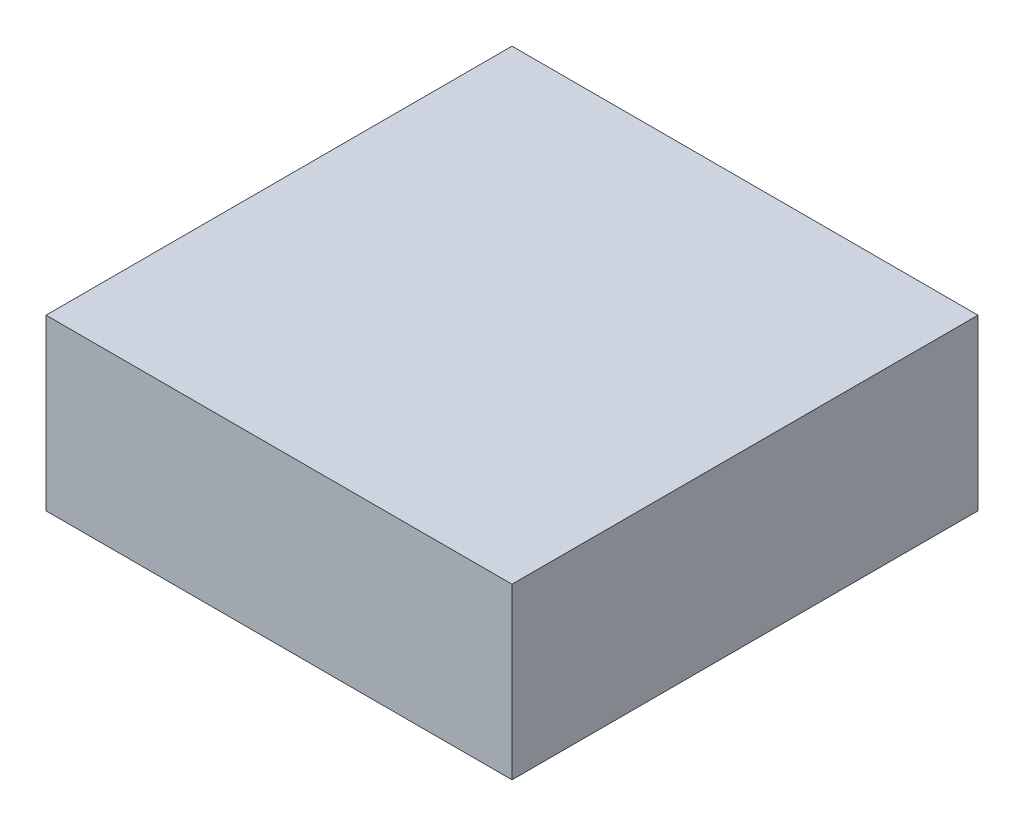
ISO-10303-21;
HEADER;
FILE_DESCRIPTION(('STEP AP214'),'2;1');
FILE_NAME('part.step','',(''),(''),'','','');
FILE_SCHEMA(('AUTOMOTIVE_DESIGN { 1 0 10303 214 1 1 1 1 }'));
ENDSEC;
DATA;
#1=APPLICATION_CONTEXT('core data for automotive mechanical design processes');
#2=APPLICATION_PROTOCOL_DEFINITION('international standard','automotive_design',2000,#1);
#3=PRODUCT_CONTEXT('',#1,'mechanical');
#4=PRODUCT('Part','Part','',(#3));
#5=PRODUCT_RELATED_PRODUCT_CATEGORY('part','',(#4));
#6=PRODUCT_DEFINITION_FORMATION('','',#4);
#7=PRODUCT_DEFINITION_CONTEXT('part definition',#1,'design');
#8=PRODUCT_DEFINITION('design','',#6,#7);
#9=PRODUCT_DEFINITION_SHAPE('','',#8);
#10=(LENGTH_UNIT() NAMED_UNIT(*) SI_UNIT(.MILLI.,.METRE.));
#11=(NAMED_UNIT(*) PLANE_ANGLE_UNIT() SI_UNIT($,.RADIAN.));
#12=(NAMED_UNIT(*) SI_UNIT($,.STERADIAN.) SOLID_ANGLE_UNIT());
#13=UNCERTAINTY_MEASURE_WITH_UNIT(LENGTH_MEASURE(1.E-05),#10,'distance_accuracy_value','');
#14=(GEOMETRIC_REPRESENTATION_CONTEXT(3) GLOBAL_UNCERTAINTY_ASSIGNED_CONTEXT((#13)) GLOBAL_UNIT_ASSIGNED_CONTEXT((#10,
#11,#12)) REPRESENTATION_CONTEXT('',''));
#15=CARTESIAN_POINT('',(0.,0.,0.));
#16=DIRECTION('',(0.,0.,1.));
#17=DIRECTION('',(1.,0.,0.));
#18=AXIS2_PLACEMENT_3D('',#15,#16,#17);
#19=CARTESIAN_POINT('',(55.,44.,-55.));
#20=DIRECTION('',(1.,0.,0.));
#21=DIRECTION('',(0.,0.,-1.));
#22=AXIS2_PLACEMENT_3D('',#19,#20,#21);
#23=PLANE('',#22);
#24=DIRECTION('',(0.,0.,1.));
#25=VECTOR('',#24,1.);
#26=CARTESIAN_POINT('',(55.,4.,-55.));
#27=LINE('',#26,#25);
#28=CARTESIAN_POINT('',(55.,4.,-55.));
#29=VERTEX_POINT('',#28);
#30=CARTESIAN_POINT('',(55.,3.99999999999999,55.));
#31=VERTEX_POINT('',#30);
#32=EDGE_CURVE('E113',#29,#31,#27,.T.);
#33=ORIENTED_EDGE('',*,*,#32,.F.);
#34=DIRECTION('',(0.,-1.,0.));
#35=VECTOR('',#34,1.);
#36=CARTESIAN_POINT('',(55.,44.,-55.));
#37=LINE('',#36,#35);
#38=CARTESIAN_POINT('',(55.,44.,-55.));
#39=VERTEX_POINT('',#38);
#40=EDGE_CURVE('E109',#39,#29,#37,.T.);
#41=ORIENTED_EDGE('',*,*,#40,.F.);
#42=DIRECTION('',(0.,0.,1.));
#43=VECTOR('',#42,1.);
#44=CARTESIAN_POINT('',(55.,44.,-55.));
#45=LINE('',#44,#43);
#46=CARTESIAN_POINT('',(55.,44.,55.));
#47=VERTEX_POINT('',#46);
#48=EDGE_CURVE('E102',#39,#47,#45,.T.);
#49=ORIENTED_EDGE('',*,*,#48,.T.);
#50=DIRECTION('',(0.,-1.,0.));
#51=VECTOR('',#50,1.);
#52=CARTESIAN_POINT('',(55.,44.,55.));
#53=LINE('',#52,#51);
#54=EDGE_CURVE('E86',#47,#31,#53,.T.);
#55=ORIENTED_EDGE('',*,*,#54,.T.);
#56=EDGE_LOOP('',(#33,#41,#49,#55));
#57=FACE_BOUND('',#56,.T.);
#58=ADVANCED_FACE('F46',(#57),#23,.T.);
#59=CARTESIAN_POINT('',(-55.,44.,-55.));
#60=DIRECTION('',(0.,0.,-1.));
#61=DIRECTION('',(-1.,0.,0.));
#62=AXIS2_PLACEMENT_3D('',#59,#60,#61);
#63=PLANE('',#62);
#64=DIRECTION('',(1.,0.,0.));
#65=VECTOR('',#64,1.);
#66=CARTESIAN_POINT('',(-55.,4.,-55.));
#67=LINE('',#66,#65);
#68=CARTESIAN_POINT('',(-55.,4.,-55.));
#69=VERTEX_POINT('',#68);
#70=EDGE_CURVE('E130',#69,#29,#67,.T.);
#71=ORIENTED_EDGE('',*,*,#70,.F.);
#72=DIRECTION('',(0.,-1.,0.));
#73=VECTOR('',#72,1.);
#74=CARTESIAN_POINT('',(-55.,44.,-55.));
#75=LINE('',#74,#73);
#76=CARTESIAN_POINT('',(-55.,44.,-55.));
#77=VERTEX_POINT('',#76);
#78=EDGE_CURVE('E122',#77,#69,#75,.T.);
#79=ORIENTED_EDGE('',*,*,#78,.F.);
#80=DIRECTION('',(1.,0.,0.));
#81=VECTOR('',#80,1.);
#82=CARTESIAN_POINT('',(-55.,44.,-55.));
#83=LINE('',#82,#81);
#84=EDGE_CURVE('E96',#77,#39,#83,.T.);
#85=ORIENTED_EDGE('',*,*,#84,.T.);
#86=ORIENTED_EDGE('',*,*,#40,.T.);
#87=EDGE_LOOP('',(#71,#79,#85,#86));
#88=FACE_BOUND('',#87,.T.);
#89=ADVANCED_FACE('F178',(#88),#63,.T.);
#90=CARTESIAN_POINT('',(-55.,44.,-55.));
#91=DIRECTION('',(-1.,0.,0.));
#92=DIRECTION('',(0.,0.,1.));
#93=AXIS2_PLACEMENT_3D('',#90,#91,#92);
#94=PLANE('',#93);
#95=DIRECTION('',(0.,0.,-1.));
#96=VECTOR('',#95,1.);
#97=CARTESIAN_POINT('',(-55.,4.,-55.));
#98=LINE('',#97,#96);
#99=CARTESIAN_POINT('',(-55.,3.99999999999999,55.));
#100=VERTEX_POINT('',#99);
#101=EDGE_CURVE('E63',#100,#69,#98,.T.);
#102=ORIENTED_EDGE('',*,*,#101,.F.);
#103=DIRECTION('',(0.,-1.,0.));
#104=VECTOR('',#103,1.);
#105=CARTESIAN_POINT('',(-55.,44.,55.));
#106=LINE('',#105,#104);
#107=CARTESIAN_POINT('',(-55.,44.,55.));
#108=VERTEX_POINT('',#107);
#109=EDGE_CURVE('E95',#108,#100,#106,.T.);
#110=ORIENTED_EDGE('',*,*,#109,.F.);
#111=DIRECTION('',(0.,0.,-1.));
#112=VECTOR('',#111,1.);
#113=CARTESIAN_POINT('',(-55.,44.,-55.));
#114=LINE('',#113,#112);
#115=EDGE_CURVE('E105',#108,#77,#114,.T.);
#116=ORIENTED_EDGE('',*,*,#115,.T.);
#117=ORIENTED_EDGE('',*,*,#78,.T.);
#118=EDGE_LOOP('',(#102,#110,#116,#117));
#119=FACE_BOUND('',#118,.T.);
#120=ADVANCED_FACE('F128',(#119),#94,.T.);
#121=CARTESIAN_POINT('',(-55.,44.,55.));
#122=DIRECTION('',(0.,0.,1.));
#123=DIRECTION('',(1.,0.,0.));
#124=AXIS2_PLACEMENT_3D('',#121,#122,#123);
#125=PLANE('',#124);
#126=DIRECTION('',(-1.,0.,0.));
#127=VECTOR('',#126,1.);
#128=CARTESIAN_POINT('',(-55.,3.99999999999999,55.));
#129=LINE('',#128,#127);
#130=EDGE_CURVE('E49',#31,#100,#129,.T.);
#131=ORIENTED_EDGE('',*,*,#130,.F.);
#132=ORIENTED_EDGE('',*,*,#54,.F.);
#133=DIRECTION('',(-1.,0.,0.));
#134=VECTOR('',#133,1.);
#135=CARTESIAN_POINT('',(-55.,44.,55.));
#136=LINE('',#135,#134);
#137=EDGE_CURVE('E90',#47,#108,#136,.T.);
#138=ORIENTED_EDGE('',*,*,#137,.T.);
#139=ORIENTED_EDGE('',*,*,#109,.T.);
#140=EDGE_LOOP('',(#131,#132,#138,#139));
#141=FACE_BOUND('',#140,.T.);
#142=ADVANCED_FACE('F88',(#141),#125,.T.);
#143=CARTESIAN_POINT('',(0.,44.,0.));
#144=DIRECTION('',(0.,1.,0.));
#145=DIRECTION('',(0.,0.,1.));
#146=AXIS2_PLACEMENT_3D('',#143,#144,#145);
#147=PLANE('',#146);
#148=ORIENTED_EDGE('',*,*,#48,.F.);
#149=ORIENTED_EDGE('',*,*,#84,.F.);
#150=ORIENTED_EDGE('',*,*,#115,.F.);
#151=ORIENTED_EDGE('',*,*,#137,.F.);
#152=EDGE_LOOP('',(#148,#149,#150,#151));
#153=FACE_BOUND('',#152,.T.);
#154=ADVANCED_FACE('F100',(#153),#147,.T.);
#155=CARTESIAN_POINT('',(0.,0.,0.));
#156=DIRECTION('',(0.,1.,0.));
#157=DIRECTION('',(0.,0.,1.));
#158=AXIS2_PLACEMENT_3D('',#155,#156,#157);
#159=PLANE('',#158);
#160=CARTESIAN_POINT('',(-8.,0.,-8.));
#161=DIRECTION('',(0.,1.,0.));
#162=DIRECTION('',(0.,0.,1.));
#163=AXIS2_PLACEMENT_3D('',#160,#161,#162);
#164=CIRCLE('',#163,3.86035948057426);
#165=CARTESIAN_POINT('',(-8.,0.,-4.13964051942574));
#166=VERTEX_POINT('',#165);
#167=EDGE_CURVE('E155',#166,#166,#164,.F.);
#168=ORIENTED_EDGE('',*,*,#167,.T.);
#169=EDGE_LOOP('',(#168));
#170=FACE_BOUND('',#169,.T.);
#171=ADVANCED_FACE('F192',(#170),#159,.F.);
#172=CARTESIAN_POINT('',(-8.,8.,-8.));
#173=DIRECTION('',(0.,1.,0.));
#174=DIRECTION('',(0.,0.,1.));
#175=AXIS2_PLACEMENT_3D('',#172,#173,#174);
#176=CONICAL_SURFACE('',#175,4.,0.0174532925199433);
#177=ORIENTED_EDGE('',*,*,#167,.F.);
#178=EDGE_LOOP('',(#177));
#179=FACE_BOUND('',#178,.T.);
#180=CARTESIAN_POINT('',(-8.,8.,-8.));
#181=DIRECTION('',(0.,1.,0.));
#182=DIRECTION('',(0.,0.,1.));
#183=AXIS2_PLACEMENT_3D('',#180,#181,#182);
#184=CIRCLE('',#183,4.);
#185=CARTESIAN_POINT('',(-8.,8.,-4.));
#186=VERTEX_POINT('',#185);
#187=EDGE_CURVE('E141',#186,#186,#184,.T.);
#188=ORIENTED_EDGE('',*,*,#187,.F.);
#189=EDGE_LOOP('',(#188));
#190=FACE_BOUND('',#189,.T.);
#191=ADVANCED_FACE('F196',(#179,#190),#176,.T.);
#192=CARTESIAN_POINT('',(8.00000000000002,8.,-7.99999999999997));
#193=DIRECTION('',(0.,1.,0.));
#194=DIRECTION('',(0.,0.,1.));
#195=AXIS2_PLACEMENT_3D('',#192,#193,#194);
#196=CONICAL_SURFACE('',#195,4.,0.0174532925199433);
#197=CARTESIAN_POINT('',(8.00000000000002,0.,-7.99999999999997));
#198=DIRECTION('',(0.,-1.,0.));
#199=DIRECTION('',(0.,0.,-1.));
#200=AXIS2_PLACEMENT_3D('',#197,#198,#199);
#201=CIRCLE('',#200,3.86035948057426);
#202=CARTESIAN_POINT('',(8.00000000000002,0.,-11.8603594805742));
#203=VERTEX_POINT('',#202);
#204=EDGE_CURVE('E136',#203,#203,#201,.T.);
#205=ORIENTED_EDGE('',*,*,#204,.F.);
#206=EDGE_LOOP('',(#205));
#207=FACE_BOUND('',#206,.T.);
#208=CARTESIAN_POINT('',(8.00000000000002,8.,-7.99999999999997));
#209=DIRECTION('',(0.,1.,0.));
#210=DIRECTION('',(0.,0.,1.));
#211=AXIS2_PLACEMENT_3D('',#208,#209,#210);
#212=CIRCLE('',#211,4.);
#213=CARTESIAN_POINT('',(8.00000000000002,8.,-3.99999999999997));
#214=VERTEX_POINT('',#213);
#215=EDGE_CURVE('E140',#214,#214,#212,.T.);
#216=ORIENTED_EDGE('',*,*,#215,.F.);
#217=EDGE_LOOP('',(#216));
#218=FACE_BOUND('',#217,.T.);
#219=ADVANCED_FACE('F201',(#207,#218),#196,.T.);
#220=CARTESIAN_POINT('',(7.99999999999994,8.,8.00000000000005));
#221=DIRECTION('',(0.,1.,0.));
#222=DIRECTION('',(0.,0.,1.));
#223=AXIS2_PLACEMENT_3D('',#220,#221,#222);
#224=CONICAL_SURFACE('',#223,4.,0.0174532925199433);
#225=CARTESIAN_POINT('',(7.99999999999994,0.,8.00000000000005));
#226=DIRECTION('',(0.,-1.,0.));
#227=DIRECTION('',(0.,0.,-1.));
#228=AXIS2_PLACEMENT_3D('',#225,#226,#227);
#229=CIRCLE('',#228,3.86035948057426);
#230=CARTESIAN_POINT('',(7.99999999999994,0.,4.13964051942579));
#231=VERTEX_POINT('',#230);
#232=EDGE_CURVE('E142',#231,#231,#229,.T.);
#233=ORIENTED_EDGE('',*,*,#232,.F.);
#234=EDGE_LOOP('',(#233));
#235=FACE_BOUND('',#234,.T.);
#236=CARTESIAN_POINT('',(7.99999999999994,8.,8.00000000000005));
#237=DIRECTION('',(0.,1.,0.));
#238=DIRECTION('',(0.,0.,1.));
#239=AXIS2_PLACEMENT_3D('',#236,#237,#238);
#240=CIRCLE('',#239,4.);
#241=CARTESIAN_POINT('',(7.99999999999994,8.,12.0000000000001));
#242=VERTEX_POINT('',#241);
#243=EDGE_CURVE('E146',#242,#242,#240,.T.);
#244=ORIENTED_EDGE('',*,*,#243,.F.);
#245=EDGE_LOOP('',(#244));
#246=FACE_BOUND('',#245,.T.);
#247=ADVANCED_FACE('F217',(#235,#246),#224,.T.);
#248=CARTESIAN_POINT('',(-8.00000000000008,8.,7.99999999999992));
#249=DIRECTION('',(0.,1.,0.));
#250=DIRECTION('',(0.,0.,1.));
#251=AXIS2_PLACEMENT_3D('',#248,#249,#250);
#252=CONICAL_SURFACE('',#251,4.,0.0174532925199433);
#253=CARTESIAN_POINT('',(-8.00000000000008,0.,7.99999999999992));
#254=DIRECTION('',(0.,-1.,0.));
#255=DIRECTION('',(0.,0.,-1.));
#256=AXIS2_PLACEMENT_3D('',#253,#254,#255);
#257=CIRCLE('',#256,3.86035948057426);
#258=CARTESIAN_POINT('',(-8.00000000000008,0.,4.13964051942566));
#259=VERTEX_POINT('',#258);
#260=EDGE_CURVE('E147',#259,#259,#257,.T.);
#261=ORIENTED_EDGE('',*,*,#260,.F.);
#262=EDGE_LOOP('',(#261));
#263=FACE_BOUND('',#262,.T.);
#264=CARTESIAN_POINT('',(-8.00000000000008,8.,7.99999999999992));
#265=DIRECTION('',(0.,1.,0.));
#266=DIRECTION('',(0.,0.,1.));
#267=AXIS2_PLACEMENT_3D('',#264,#265,#266);
#268=CIRCLE('',#267,4.);
#269=CARTESIAN_POINT('',(-8.00000000000008,8.,11.9999999999999));
#270=VERTEX_POINT('',#269);
#271=EDGE_CURVE('E151',#270,#270,#268,.T.);
#272=ORIENTED_EDGE('',*,*,#271,.F.);
#273=EDGE_LOOP('',(#272));
#274=FACE_BOUND('',#273,.T.);
#275=ADVANCED_FACE('F213',(#263,#274),#252,.T.);
#276=CARTESIAN_POINT('',(0.,8.,0.));
#277=DIRECTION('',(0.,1.,0.));
#278=DIRECTION('',(0.,0.,1.));
#279=AXIS2_PLACEMENT_3D('',#276,#277,#278);
#280=PLANE('',#279);
#281=ORIENTED_EDGE('',*,*,#271,.T.);
#282=EDGE_LOOP('',(#281));
#283=FACE_BOUND('',#282,.T.);
#284=ORIENTED_EDGE('',*,*,#243,.T.);
#285=EDGE_LOOP('',(#284));
#286=FACE_BOUND('',#285,.T.);
#287=ORIENTED_EDGE('',*,*,#215,.T.);
#288=EDGE_LOOP('',(#287));
#289=FACE_BOUND('',#288,.T.);
#290=ORIENTED_EDGE('',*,*,#187,.T.);
#291=EDGE_LOOP('',(#290));
#292=FACE_BOUND('',#291,.T.);
#293=CARTESIAN_POINT('',(0.,8.,0.));
#294=DIRECTION('',(0.,-1.,0.));
#295=DIRECTION('',(0.,0.,-1.));
#296=AXIS2_PLACEMENT_3D('',#293,#294,#295);
#297=CIRCLE('',#296,20.);
#298=CARTESIAN_POINT('',(0.,8.,-20.));
#299=VERTEX_POINT('',#298);
#300=EDGE_CURVE('E55',#299,#299,#297,.T.);
#301=ORIENTED_EDGE('',*,*,#300,.T.);
#302=EDGE_LOOP('',(#301));
#303=FACE_BOUND('',#302,.T.);
#304=ADVANCED_FACE('F209',(#283,#286,#289,#292,#303),#280,.F.);
#305=CARTESIAN_POINT('',(0.,4.,0.));
#306=DIRECTION('',(0.,-1.,0.));
#307=DIRECTION('',(0.,0.,-1.));
#308=AXIS2_PLACEMENT_3D('',#305,#306,#307);
#309=TOROIDAL_SURFACE('',#308,26.9282032302755,8.);
#310=CARTESIAN_POINT('',(0.,4.,0.));
#311=DIRECTION('',(0.,-1.,0.));
#312=DIRECTION('',(0.,0.,-1.));
#313=AXIS2_PLACEMENT_3D('',#310,#311,#312);
#314=CIRCLE('',#313,34.9282032302755);
#315=CARTESIAN_POINT('',(0.,4.,-34.9282032302755));
#316=VERTEX_POINT('',#315);
#317=EDGE_CURVE('E11',#316,#316,#314,.T.);
#318=ORIENTED_EDGE('',*,*,#317,.T.);
#319=EDGE_LOOP('',(#318));
#320=FACE_BOUND('',#319,.T.);
#321=ORIENTED_EDGE('',*,*,#300,.F.);
#322=EDGE_LOOP('',(#321));
#323=FACE_BOUND('',#322,.T.);
#324=ADVANCED_FACE('F205',(#320,#323),#309,.F.);
#325=CARTESIAN_POINT('',(0.,0.,0.));
#326=DIRECTION('',(0.,1.,0.));
#327=DIRECTION('',(0.,0.,1.));
#328=AXIS2_PLACEMENT_3D('',#325,#326,#327);
#329=PLANE('',#328);
#330=ORIENTED_EDGE('',*,*,#204,.T.);
#331=EDGE_LOOP('',(#330));
#332=FACE_BOUND('',#331,.T.);
#333=ADVANCED_FACE('F208',(#332),#329,.F.);
#334=CARTESIAN_POINT('',(0.,0.,0.));
#335=DIRECTION('',(0.,1.,0.));
#336=DIRECTION('',(0.,0.,1.));
#337=AXIS2_PLACEMENT_3D('',#334,#335,#336);
#338=PLANE('',#337);
#339=ORIENTED_EDGE('',*,*,#232,.T.);
#340=EDGE_LOOP('',(#339));
#341=FACE_BOUND('',#340,.T.);
#342=ADVANCED_FACE('F227',(#341),#338,.F.);
#343=CARTESIAN_POINT('',(0.,0.,0.));
#344=DIRECTION('',(0.,1.,0.));
#345=DIRECTION('',(0.,0.,1.));
#346=AXIS2_PLACEMENT_3D('',#343,#344,#345);
#347=PLANE('',#346);
#348=ORIENTED_EDGE('',*,*,#260,.T.);
#349=EDGE_LOOP('',(#348));
#350=FACE_BOUND('',#349,.T.);
#351=ADVANCED_FACE('F231',(#350),#347,.F.);
#352=CARTESIAN_POINT('',(-0.725366670454234,4.,-34.9282043037022));
#353=DIRECTION('',(0.,1.,0.));
#354=DIRECTION('',(0.999999999998905,0.,1.47984011281865E-06));
#355=AXIS2_PLACEMENT_3D('',#352,#353,#354);
#356=PLANE('',#355);
#357=ORIENTED_EDGE('',*,*,#32,.T.);
#358=ORIENTED_EDGE('',*,*,#130,.T.);
#359=ORIENTED_EDGE('',*,*,#101,.T.);
#360=ORIENTED_EDGE('',*,*,#70,.T.);
#361=EDGE_LOOP('',(#357,#358,#359,#360));
#362=FACE_BOUND('',#361,.T.);
#363=ORIENTED_EDGE('',*,*,#317,.F.);
#364=EDGE_LOOP('',(#363));
#365=FACE_BOUND('',#364,.T.);
#366=ADVANCED_FACE('F175',(#362,#365),#356,.F.);
#367=CLOSED_SHELL('',(#58,#89,#120,#142,#154,#171,#191,#219,#247,#275,#304,#324,#333,#342,#351,#366));
#368=MANIFOLD_SOLID_BREP('B2',#367);
#369=ADVANCED_BREP_SHAPE_REPRESENTATION('',(#18,#368),#14);
#370=SHAPE_DEFINITION_REPRESENTATION(#9,#369);
ENDSEC;
END-ISO-10303-21;
